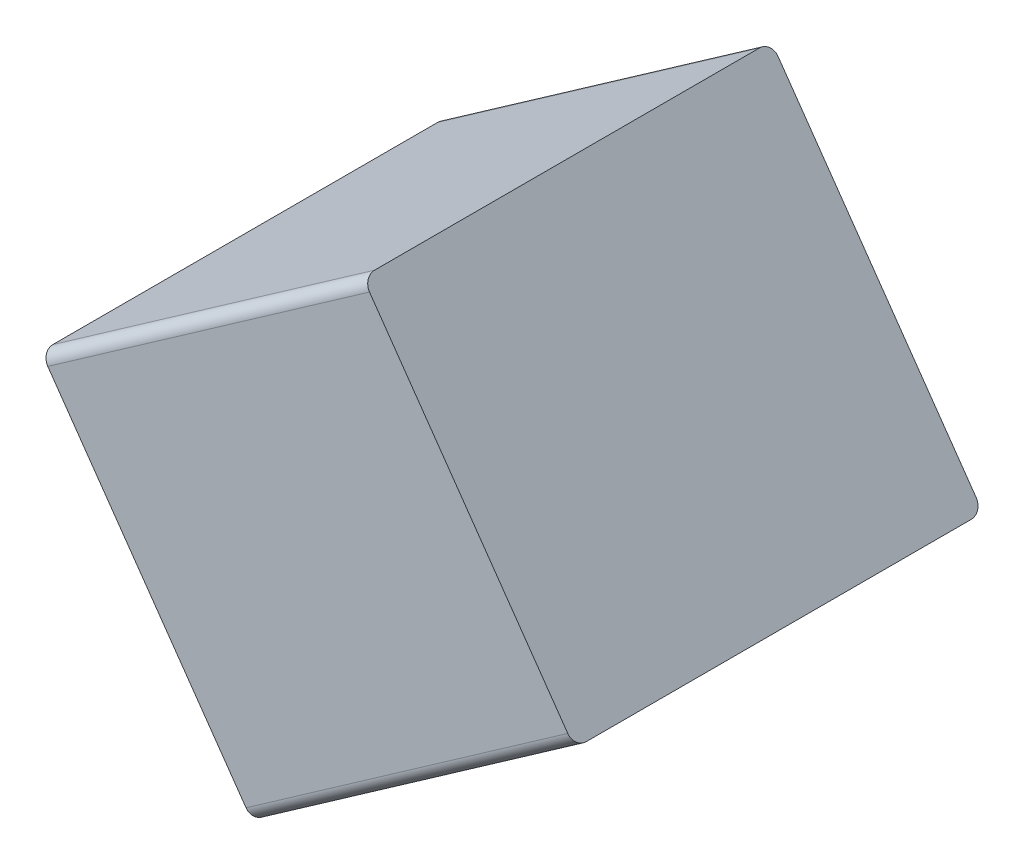
ISO-10303-21;
HEADER;
FILE_DESCRIPTION(('STEP AP214'),'2;1');
FILE_NAME('part.step','',(''),(''),'','','');
FILE_SCHEMA(('AUTOMOTIVE_DESIGN { 1 0 10303 214 1 1 1 1 }'));
ENDSEC;
DATA;
#1=APPLICATION_CONTEXT('core data for automotive mechanical design processes');
#2=APPLICATION_PROTOCOL_DEFINITION('international standard','automotive_design',2000,#1);
#3=PRODUCT_CONTEXT('',#1,'mechanical');
#4=PRODUCT('Part','Part','',(#3));
#5=PRODUCT_RELATED_PRODUCT_CATEGORY('part','',(#4));
#6=PRODUCT_DEFINITION_FORMATION('','',#4);
#7=PRODUCT_DEFINITION_CONTEXT('part definition',#1,'design');
#8=PRODUCT_DEFINITION('design','',#6,#7);
#9=PRODUCT_DEFINITION_SHAPE('','',#8);
#10=(LENGTH_UNIT() NAMED_UNIT(*) SI_UNIT(.MILLI.,.METRE.));
#11=(NAMED_UNIT(*) PLANE_ANGLE_UNIT() SI_UNIT($,.RADIAN.));
#12=(NAMED_UNIT(*) SI_UNIT($,.STERADIAN.) SOLID_ANGLE_UNIT());
#13=UNCERTAINTY_MEASURE_WITH_UNIT(LENGTH_MEASURE(1.E-05),#10,'distance_accuracy_value','');
#14=(GEOMETRIC_REPRESENTATION_CONTEXT(3) GLOBAL_UNCERTAINTY_ASSIGNED_CONTEXT((#13)) GLOBAL_UNIT_ASSIGNED_CONTEXT((#10,
#11,#12)) REPRESENTATION_CONTEXT('',''));
#15=CARTESIAN_POINT('',(0.,0.,0.));
#16=DIRECTION('',(0.,0.,1.));
#17=DIRECTION('',(1.,0.,0.));
#18=AXIS2_PLACEMENT_3D('',#15,#16,#17);
#19=CARTESIAN_POINT('',(-17.33957913142,-14.95089402347,0.534999999973));
#20=DIRECTION('',(0.,0.,1.));
#21=DIRECTION('',(1.,0.,0.));
#22=AXIS2_PLACEMENT_3D('',#19,#20,#21);
#23=PLANE('',#22);
#24=DIRECTION('',(0.819152069955886,0.57357639969492,0.));
#25=VECTOR('',#24,1.);
#26=CARTESIAN_POINT('',(-17.0786018695405,-15.3236082153293,0.534999999973));
#27=LINE('',#26,#25);
#28=CARTESIAN_POINT('',(-16.6690258345628,-15.0368200154825,0.534999999973));
#29=VERTEX_POINT('',#28);
#30=CARTESIAN_POINT('',(-17.078601869538,-15.3236082153281,0.534999999973));
#31=VERTEX_POINT('',#30);
#32=EDGE_CURVE('E83',#29,#31,#27,.F.);
#33=ORIENTED_EDGE('',*,*,#32,.F.);
#34=DIRECTION('',(-0.57357639969492,0.819152069955886,0.));
#35=VECTOR('',#34,1.);
#36=CARTESIAN_POINT('',(-16.79521264251,-14.85660656007,0.534999999973));
#37=LINE('',#36,#35);
#38=CARTESIAN_POINT('',(-16.9213994504451,-14.6763931046747,0.534999999973));
#39=VERTEX_POINT('',#38);
#40=EDGE_CURVE('E124',#39,#29,#37,.F.);
#41=ORIENTED_EDGE('',*,*,#40,.F.);
#42=DIRECTION('',(0.819152069955886,0.57357639969492,0.));
#43=VECTOR('',#42,1.);
#44=CARTESIAN_POINT('',(-17.33097548542,-14.96318130452,0.534999999973));
#45=LINE('',#44,#43);
#46=CARTESIAN_POINT('',(-17.3309754854213,-14.9631813045209,0.534999999973));
#47=VERTEX_POINT('',#46);
#48=EDGE_CURVE('E112',#47,#39,#45,.T.);
#49=ORIENTED_EDGE('',*,*,#48,.F.);
#50=DIRECTION('',(-0.57357639969492,0.819152069955886,0.));
#51=VECTOR('',#50,1.);
#52=CARTESIAN_POINT('',(-17.20478867748,-15.14339475992,0.534999999973));
#53=LINE('',#52,#51);
#54=EDGE_CURVE('E72',#47,#31,#53,.F.);
#55=ORIENTED_EDGE('',*,*,#54,.T.);
#56=EDGE_LOOP('',(#33,#41,#49,#55));
#57=FACE_BOUND('',#56,.T.);
#58=ADVANCED_FACE('F17',(#57),#23,.T.);
#59=CARTESIAN_POINT('',(-17.07860186954,-15.32360821533,0.519999999973));
#60=DIRECTION('',(0.819152069955886,0.57357639969492,0.));
#61=DIRECTION('',(-0.57357639969492,0.819152069955886,0.));
#62=AXIS2_PLACEMENT_3D('',#59,#60,#61);
#63=CYLINDRICAL_SURFACE('',#62,0.015);
#64=CARTESIAN_POINT('',(-17.07860186954,-15.32360821533,0.519999999973));
#65=DIRECTION('',(0.819152069955886,0.57357639969492,0.));
#66=DIRECTION('',(-0.57357639969492,0.819152069955886,0.));
#67=AXIS2_PLACEMENT_3D('',#64,#65,#66);
#68=CIRCLE('',#67,0.015);
#69=CARTESIAN_POINT('',(-17.0699982235405,-15.3358954963804,0.519999999973));
#70=VERTEX_POINT('',#69);
#71=EDGE_CURVE('E20',#31,#70,#68,.T.);
#72=ORIENTED_EDGE('',*,*,#71,.T.);
#73=DIRECTION('',(0.819152069955886,0.57357639969492,0.));
#74=VECTOR('',#73,1.);
#75=CARTESIAN_POINT('',(-17.06999822354,-15.33589549638,0.519999999973));
#76=LINE('',#75,#74);
#77=CARTESIAN_POINT('',(-16.6604221885681,-15.0491072965327,0.519999999973));
#78=VERTEX_POINT('',#77);
#79=EDGE_CURVE('E81',#78,#70,#76,.F.);
#80=ORIENTED_EDGE('',*,*,#79,.F.);
#81=CARTESIAN_POINT('',(-16.6690258345634,-15.0368200154835,0.519999999973));
#82=DIRECTION('',(0.819152069955886,0.57357639969492,0.));
#83=DIRECTION('',(-0.57357639969492,0.819152069955886,0.));
#84=AXIS2_PLACEMENT_3D('',#81,#82,#83);
#85=CIRCLE('',#84,0.015);
#86=EDGE_CURVE('E122',#29,#78,#85,.T.);
#87=ORIENTED_EDGE('',*,*,#86,.F.);
#88=ORIENTED_EDGE('',*,*,#32,.T.);
#89=EDGE_LOOP('',(#72,#80,#87,#88));
#90=FACE_BOUND('',#89,.T.);
#91=ADVANCED_FACE('F79',(#90),#63,.T.);
#92=CARTESIAN_POINT('',(-17.06999822354,-15.33589549638,0.534999999973));
#93=DIRECTION('',(0.57357639969492,-0.819152069955886,0.));
#94=DIRECTION('',(0.819152069955886,0.57357639969492,0.));
#95=AXIS2_PLACEMENT_3D('',#92,#93,#94);
#96=PLANE('',#95);
#97=DIRECTION('',(0.819152069955886,0.57357639969492,0.));
#98=VECTOR('',#97,1.);
#99=CARTESIAN_POINT('',(-17.0699982235446,-15.3358954963793,0.02999999999243));
#100=LINE('',#99,#98);
#101=CARTESIAN_POINT('',(-16.6604221885651,-15.0491072965287,0.02999999999243));
#102=VERTEX_POINT('',#101);
#103=CARTESIAN_POINT('',(-17.0699982235409,-15.3358954963787,0.02999999999243));
#104=VERTEX_POINT('',#103);
#105=EDGE_CURVE('E94',#102,#104,#100,.F.);
#106=ORIENTED_EDGE('',*,*,#105,.F.);
#107=DIRECTION('',(0.,0.,1.));
#108=VECTOR('',#107,1.);
#109=CARTESIAN_POINT('',(-16.6604221885683,-15.0491072965288,0.275));
#110=LINE('',#109,#108);
#111=EDGE_CURVE('E92',#78,#102,#110,.F.);
#112=ORIENTED_EDGE('',*,*,#111,.F.);
#113=ORIENTED_EDGE('',*,*,#79,.T.);
#114=DIRECTION('',(0.,0.,1.));
#115=VECTOR('',#114,1.);
#116=CARTESIAN_POINT('',(-17.0699982235383,-15.3358954963788,0.275));
#117=LINE('',#116,#115);
#118=EDGE_CURVE('E86',#70,#104,#117,.F.);
#119=ORIENTED_EDGE('',*,*,#118,.T.);
#120=EDGE_LOOP('',(#106,#112,#113,#119));
#121=FACE_BOUND('',#120,.T.);
#122=ADVANCED_FACE('F89',(#121),#96,.T.);
#123=CARTESIAN_POINT('',(-17.07860186954,-15.32360821533,0.02999999999243));
#124=DIRECTION('',(0.819152069955886,0.57357639969492,0.));
#125=DIRECTION('',(-0.57357639969492,0.819152069955886,0.));
#126=AXIS2_PLACEMENT_3D('',#123,#124,#125);
#127=CYLINDRICAL_SURFACE('',#126,0.015);
#128=CARTESIAN_POINT('',(-17.0786018695372,-15.3236082153281,0.02999999999243));
#129=DIRECTION('',(0.819152069955886,0.57357639969492,0.));
#130=DIRECTION('',(-0.57357639969492,0.819152069955886,0.));
#131=AXIS2_PLACEMENT_3D('',#128,#129,#130);
#132=CIRCLE('',#131,0.015);
#133=CARTESIAN_POINT('',(-17.0786018695364,-15.3236082153275,0.01499999999243));
#134=VERTEX_POINT('',#133);
#135=EDGE_CURVE('E99',#104,#134,#132,.T.);
#136=ORIENTED_EDGE('',*,*,#135,.T.);
#137=DIRECTION('',(-0.819152069954856,-0.573576399696392,0.));
#138=VECTOR('',#137,1.);
#139=CARTESIAN_POINT('',(-16.66902583456,-15.03682001548,0.01499999999243));
#140=LINE('',#139,#138);
#141=CARTESIAN_POINT('',(-16.6690258345609,-15.0368200154811,0.01499999999243));
#142=VERTEX_POINT('',#141);
#143=EDGE_CURVE('E107',#142,#134,#140,.T.);
#144=ORIENTED_EDGE('',*,*,#143,.F.);
#145=CARTESIAN_POINT('',(-16.6690258345595,-15.0368200154807,0.02999999999243));
#146=DIRECTION('',(0.819152069955886,0.57357639969492,0.));
#147=DIRECTION('',(-0.57357639969492,0.819152069955886,0.));
#148=AXIS2_PLACEMENT_3D('',#145,#146,#147);
#149=CIRCLE('',#148,0.015);
#150=EDGE_CURVE('E118',#102,#142,#149,.T.);
#151=ORIENTED_EDGE('',*,*,#150,.F.);
#152=ORIENTED_EDGE('',*,*,#105,.T.);
#153=EDGE_LOOP('',(#136,#144,#151,#152));
#154=FACE_BOUND('',#153,.T.);
#155=ADVANCED_FACE('F211',(#154),#127,.T.);
#156=CARTESIAN_POINT('',(-17.06999822354,-15.33589549638,0.01499999999243));
#157=DIRECTION('',(0.,0.,-1.));
#158=DIRECTION('',(-1.,0.,0.));
#159=AXIS2_PLACEMENT_3D('',#156,#157,#158);
#160=PLANE('',#159);
#161=ORIENTED_EDGE('',*,*,#143,.T.);
#162=DIRECTION('',(-0.57357639969492,0.819152069955886,0.));
#163=VECTOR('',#162,1.);
#164=CARTESIAN_POINT('',(-17.20478867748,-15.14339475992,0.01499999999243));
#165=LINE('',#164,#163);
#166=CARTESIAN_POINT('',(-17.3309754854178,-14.9631813045229,0.01499999999243));
#167=VERTEX_POINT('',#166);
#168=EDGE_CURVE('E101',#134,#167,#165,.T.);
#169=ORIENTED_EDGE('',*,*,#168,.T.);
#170=DIRECTION('',(0.819152069955886,0.57357639969492,0.));
#171=VECTOR('',#170,1.);
#172=CARTESIAN_POINT('',(-17.3309754854158,-14.963181304526,0.01499999999243));
#173=LINE('',#172,#171);
#174=CARTESIAN_POINT('',(-16.9213994504444,-14.6763931046786,0.01499999999243));
#175=VERTEX_POINT('',#174);
#176=EDGE_CURVE('E106',#175,#167,#173,.F.);
#177=ORIENTED_EDGE('',*,*,#176,.F.);
#178=DIRECTION('',(-0.57357639969492,0.819152069955886,0.));
#179=VECTOR('',#178,1.);
#180=CARTESIAN_POINT('',(-16.79521264251,-14.85660656007,0.01499999999243));
#181=LINE('',#180,#179);
#182=EDGE_CURVE('E121',#142,#175,#181,.T.);
#183=ORIENTED_EDGE('',*,*,#182,.F.);
#184=EDGE_LOOP('',(#161,#169,#177,#183));
#185=FACE_BOUND('',#184,.T.);
#186=ADVANCED_FACE('F135',(#185),#160,.T.);
#187=CARTESIAN_POINT('',(-17.33097548542,-14.96318130452,0.02999999999243));
#188=DIRECTION('',(0.819152069955886,0.57357639969492,0.));
#189=DIRECTION('',(-0.57357639969492,0.819152069955886,0.));
#190=AXIS2_PLACEMENT_3D('',#187,#188,#189);
#191=CYLINDRICAL_SURFACE('',#190,0.015);
#192=CARTESIAN_POINT('',(-17.33097548542,-14.96318130452,0.02999999999243));
#193=DIRECTION('',(0.819152069955886,0.57357639969492,0.));
#194=DIRECTION('',(-0.57357639969492,0.819152069955886,0.));
#195=AXIS2_PLACEMENT_3D('',#192,#193,#194);
#196=CIRCLE('',#195,0.015);
#197=CARTESIAN_POINT('',(-17.3395791314186,-14.950894023469,0.02999999999243));
#198=VERTEX_POINT('',#197);
#199=EDGE_CURVE('E130',#167,#198,#196,.T.);
#200=ORIENTED_EDGE('',*,*,#199,.T.);
#201=DIRECTION('',(-0.819152069955886,-0.57357639969492,0.));
#202=VECTOR('',#201,1.);
#203=CARTESIAN_POINT('',(-17.33957913142,-14.95089402347,0.02999999999243));
#204=LINE('',#203,#202);
#205=CARTESIAN_POINT('',(-16.9300030964442,-14.664105823624,0.02999999999243));
#206=VERTEX_POINT('',#205);
#207=EDGE_CURVE('E146',#206,#198,#204,.T.);
#208=ORIENTED_EDGE('',*,*,#207,.F.);
#209=CARTESIAN_POINT('',(-16.9213994504469,-14.676393104676,0.02999999999243));
#210=DIRECTION('',(0.819152069955886,0.57357639969492,0.));
#211=DIRECTION('',(-0.57357639969492,0.819152069955886,0.));
#212=AXIS2_PLACEMENT_3D('',#209,#210,#211);
#213=CIRCLE('',#212,0.015);
#214=EDGE_CURVE('E114',#175,#206,#213,.T.);
#215=ORIENTED_EDGE('',*,*,#214,.F.);
#216=ORIENTED_EDGE('',*,*,#176,.T.);
#217=EDGE_LOOP('',(#200,#208,#215,#216));
#218=FACE_BOUND('',#217,.T.);
#219=ADVANCED_FACE('F139',(#218),#191,.T.);
#220=CARTESIAN_POINT('',(-17.20478867748,-15.14339475992,0.275));
#221=DIRECTION('',(0.819152069955886,0.57357639969492,0.));
#222=DIRECTION('',(-0.57357639969492,0.819152069955886,0.));
#223=AXIS2_PLACEMENT_3D('',#220,#221,#222);
#224=PLANE('',#223);
#225=ORIENTED_EDGE('',*,*,#168,.F.);
#226=ORIENTED_EDGE('',*,*,#135,.F.);
#227=ORIENTED_EDGE('',*,*,#118,.F.);
#228=ORIENTED_EDGE('',*,*,#71,.F.);
#229=ORIENTED_EDGE('',*,*,#54,.F.);
#230=CARTESIAN_POINT('',(-17.3309754854228,-14.9631813045219,0.519999999973));
#231=DIRECTION('',(0.819152069955886,0.57357639969492,0.));
#232=DIRECTION('',(-0.57357639969492,0.819152069955886,0.));
#233=AXIS2_PLACEMENT_3D('',#230,#231,#232);
#234=CIRCLE('',#233,0.015);
#235=CARTESIAN_POINT('',(-17.33957913142,-14.95089402347,0.519999999973));
#236=VERTEX_POINT('',#235);
#237=EDGE_CURVE('E115',#236,#47,#234,.T.);
#238=ORIENTED_EDGE('',*,*,#237,.F.);
#239=DIRECTION('',(0.,0.,1.));
#240=VECTOR('',#239,1.);
#241=CARTESIAN_POINT('',(-17.33957913142,-14.95089402347,0.01499999999243));
#242=LINE('',#241,#240);
#243=EDGE_CURVE('E142',#198,#236,#242,.T.);
#244=ORIENTED_EDGE('',*,*,#243,.F.);
#245=ORIENTED_EDGE('',*,*,#199,.F.);
#246=EDGE_LOOP('',(#225,#226,#227,#228,#229,#238,#244,#245));
#247=FACE_BOUND('',#246,.T.);
#248=ADVANCED_FACE('F98',(#247),#224,.F.);
#249=CARTESIAN_POINT('',(-17.33097548542,-14.96318130452,0.519999999973));
#250=DIRECTION('',(0.819152069955886,0.57357639969492,0.));
#251=DIRECTION('',(-0.57357639969492,0.819152069955886,0.));
#252=AXIS2_PLACEMENT_3D('',#249,#250,#251);
#253=CYLINDRICAL_SURFACE('',#252,0.015);
#254=ORIENTED_EDGE('',*,*,#237,.T.);
#255=ORIENTED_EDGE('',*,*,#48,.T.);
#256=CARTESIAN_POINT('',(-16.9213994504442,-14.676393104674,0.519999999973));
#257=DIRECTION('',(0.819152069955886,0.57357639969492,0.));
#258=DIRECTION('',(-0.57357639969492,0.819152069955886,0.));
#259=AXIS2_PLACEMENT_3D('',#256,#257,#258);
#260=CIRCLE('',#259,0.015);
#261=CARTESIAN_POINT('',(-16.9300030964428,-14.6641058236231,0.519999999973));
#262=VERTEX_POINT('',#261);
#263=EDGE_CURVE('E35',#262,#39,#260,.T.);
#264=ORIENTED_EDGE('',*,*,#263,.F.);
#265=DIRECTION('',(-0.819152069955886,-0.57357639969492,0.));
#266=VECTOR('',#265,1.);
#267=CARTESIAN_POINT('',(-17.33957913142,-14.95089402347,0.519999999973));
#268=LINE('',#267,#266);
#269=EDGE_CURVE('E26',#236,#262,#268,.F.);
#270=ORIENTED_EDGE('',*,*,#269,.F.);
#271=EDGE_LOOP('',(#254,#255,#264,#270));
#272=FACE_BOUND('',#271,.T.);
#273=ADVANCED_FACE('F161',(#272),#253,.T.);
#274=CARTESIAN_POINT('',(-16.79521264251,-14.85660656007,0.275));
#275=DIRECTION('',(0.819152069955886,0.57357639969492,0.));
#276=DIRECTION('',(-0.57357639969492,0.819152069955886,0.));
#277=AXIS2_PLACEMENT_3D('',#274,#275,#276);
#278=PLANE('',#277);
#279=ORIENTED_EDGE('',*,*,#150,.T.);
#280=ORIENTED_EDGE('',*,*,#182,.T.);
#281=ORIENTED_EDGE('',*,*,#214,.T.);
#282=DIRECTION('',(0.,0.,1.));
#283=VECTOR('',#282,1.);
#284=CARTESIAN_POINT('',(-16.9300030964442,-14.664105823624,0.01499999999243));
#285=LINE('',#284,#283);
#286=EDGE_CURVE('E11',#262,#206,#285,.F.);
#287=ORIENTED_EDGE('',*,*,#286,.F.);
#288=ORIENTED_EDGE('',*,*,#263,.T.);
#289=ORIENTED_EDGE('',*,*,#40,.T.);
#290=ORIENTED_EDGE('',*,*,#86,.T.);
#291=ORIENTED_EDGE('',*,*,#111,.T.);
#292=EDGE_LOOP('',(#279,#280,#281,#287,#288,#289,#290,#291));
#293=FACE_BOUND('',#292,.T.);
#294=ADVANCED_FACE('F156',(#293),#278,.T.);
#295=CARTESIAN_POINT('',(-17.33957913142,-14.95089402347,0.01499999999243));
#296=DIRECTION('',(-0.57357639969492,0.819152069955886,0.));
#297=DIRECTION('',(-0.819152069955886,-0.57357639969492,0.));
#298=AXIS2_PLACEMENT_3D('',#295,#296,#297);
#299=PLANE('',#298);
#300=ORIENTED_EDGE('',*,*,#269,.T.);
#301=ORIENTED_EDGE('',*,*,#286,.T.);
#302=ORIENTED_EDGE('',*,*,#207,.T.);
#303=ORIENTED_EDGE('',*,*,#243,.T.);
#304=EDGE_LOOP('',(#300,#301,#302,#303));
#305=FACE_BOUND('',#304,.T.);
#306=ADVANCED_FACE('F147',(#305),#299,.T.);
#307=CLOSED_SHELL('',(#58,#91,#122,#155,#186,#219,#248,#273,#294,#306));
#308=MANIFOLD_SOLID_BREP('B1',#307);
#309=ADVANCED_BREP_SHAPE_REPRESENTATION('',(#18,#308),#14);
#310=SHAPE_DEFINITION_REPRESENTATION(#9,#309);
ENDSEC;
END-ISO-10303-21;
